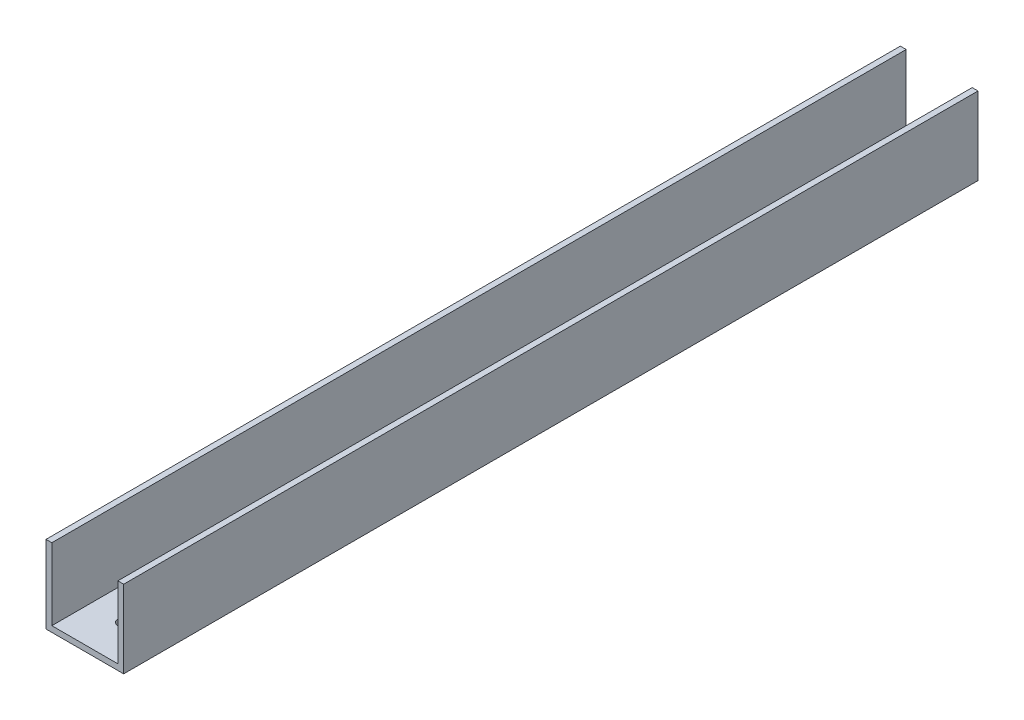
ISO-10303-21;
HEADER;
FILE_DESCRIPTION(('STEP AP214'),'2;1');
FILE_NAME('part.step','',(''),(''),'','','');
FILE_SCHEMA(('AUTOMOTIVE_DESIGN { 1 0 10303 214 1 1 1 1 }'));
ENDSEC;
DATA;
#1=APPLICATION_CONTEXT('core data for automotive mechanical design processes');
#2=APPLICATION_PROTOCOL_DEFINITION('international standard','automotive_design',2000,#1);
#3=PRODUCT_CONTEXT('',#1,'mechanical');
#4=PRODUCT('Part','Part','',(#3));
#5=PRODUCT_RELATED_PRODUCT_CATEGORY('part','',(#4));
#6=PRODUCT_DEFINITION_FORMATION('','',#4);
#7=PRODUCT_DEFINITION_CONTEXT('part definition',#1,'design');
#8=PRODUCT_DEFINITION('design','',#6,#7);
#9=PRODUCT_DEFINITION_SHAPE('','',#8);
#10=(LENGTH_UNIT() NAMED_UNIT(*) SI_UNIT(.MILLI.,.METRE.));
#11=(NAMED_UNIT(*) PLANE_ANGLE_UNIT() SI_UNIT($,.RADIAN.));
#12=(NAMED_UNIT(*) SI_UNIT($,.STERADIAN.) SOLID_ANGLE_UNIT());
#13=UNCERTAINTY_MEASURE_WITH_UNIT(LENGTH_MEASURE(1.E-05),#10,'distance_accuracy_value','');
#14=(GEOMETRIC_REPRESENTATION_CONTEXT(3) GLOBAL_UNCERTAINTY_ASSIGNED_CONTEXT((#13)) GLOBAL_UNIT_ASSIGNED_CONTEXT((#10,
#11,#12)) REPRESENTATION_CONTEXT('',''));
#15=CARTESIAN_POINT('',(0.,0.,0.));
#16=DIRECTION('',(0.,0.,1.));
#17=DIRECTION('',(1.,0.,0.));
#18=AXIS2_PLACEMENT_3D('',#15,#16,#17);
#19=CARTESIAN_POINT('',(-24.3452569943498,11.3571200850159,220.));
#20=DIRECTION('',(0.,-1.,0.));
#21=DIRECTION('',(1.,0.,0.));
#22=AXIS2_PLACEMENT_3D('',#19,#20,#21);
#23=PLANE('',#22);
#24=DIRECTION('',(-1.,0.,0.));
#25=VECTOR('',#24,1.);
#26=CARTESIAN_POINT('',(-24.3452569943498,11.3571200850159,0.));
#27=LINE('',#26,#25);
#28=CARTESIAN_POINT('',(-24.3452569943498,11.3571200850159,0.));
#29=VERTEX_POINT('',#28);
#30=CARTESIAN_POINT('',(-25.8452569943498,11.357120085016,0.));
#31=VERTEX_POINT('',#30);
#32=EDGE_CURVE('E128',#29,#31,#27,.T.);
#33=ORIENTED_EDGE('',*,*,#32,.T.);
#34=DIRECTION('',(0.,0.,-1.));
#35=VECTOR('',#34,1.);
#36=CARTESIAN_POINT('',(-25.8452569943498,11.357120085016,220.));
#37=LINE('',#36,#35);
#38=CARTESIAN_POINT('',(-25.8452569943498,11.357120085016,220.));
#39=VERTEX_POINT('',#38);
#40=EDGE_CURVE('E11',#39,#31,#37,.T.);
#41=ORIENTED_EDGE('',*,*,#40,.F.);
#42=DIRECTION('',(-1.,0.,0.));
#43=VECTOR('',#42,1.);
#44=CARTESIAN_POINT('',(-24.3452569943498,11.3571200850159,220.));
#45=LINE('',#44,#43);
#46=CARTESIAN_POINT('',(-24.3452569943498,11.3571200850159,220.));
#47=VERTEX_POINT('',#46);
#48=EDGE_CURVE('E143',#47,#39,#45,.T.);
#49=ORIENTED_EDGE('',*,*,#48,.F.);
#50=DIRECTION('',(0.,0.,-1.));
#51=VECTOR('',#50,1.);
#52=CARTESIAN_POINT('',(-24.3452569943498,11.3571200850159,220.));
#53=LINE('',#52,#51);
#54=EDGE_CURVE('E124',#47,#29,#53,.T.);
#55=ORIENTED_EDGE('',*,*,#54,.T.);
#56=EDGE_LOOP('',(#33,#41,#49,#55));
#57=FACE_BOUND('',#56,.T.);
#58=ADVANCED_FACE('F30',(#57),#23,.F.);
#59=CARTESIAN_POINT('',(-25.8452569943498,11.357120085016,220.));
#60=DIRECTION('',(1.,0.,0.));
#61=DIRECTION('',(0.,1.,0.));
#62=AXIS2_PLACEMENT_3D('',#59,#60,#61);
#63=PLANE('',#62);
#64=DIRECTION('',(0.,-1.,0.));
#65=VECTOR('',#64,1.);
#66=CARTESIAN_POINT('',(-25.8452569943498,11.357120085016,0.));
#67=LINE('',#66,#65);
#68=CARTESIAN_POINT('',(-25.8452569943498,-8.64287991498405,0.));
#69=VERTEX_POINT('',#68);
#70=EDGE_CURVE('E131',#31,#69,#67,.T.);
#71=ORIENTED_EDGE('',*,*,#70,.T.);
#72=DIRECTION('',(0.,0.,-1.));
#73=VECTOR('',#72,1.);
#74=CARTESIAN_POINT('',(-25.8452569943498,-8.64287991498405,220.));
#75=LINE('',#74,#73);
#76=CARTESIAN_POINT('',(-25.8452569943498,-8.64287991498405,220.));
#77=VERTEX_POINT('',#76);
#78=EDGE_CURVE('E39',#77,#69,#75,.T.);
#79=ORIENTED_EDGE('',*,*,#78,.F.);
#80=DIRECTION('',(0.,-1.,0.));
#81=VECTOR('',#80,1.);
#82=CARTESIAN_POINT('',(-25.8452569943498,11.357120085016,220.));
#83=LINE('',#82,#81);
#84=EDGE_CURVE('E91',#39,#77,#83,.T.);
#85=ORIENTED_EDGE('',*,*,#84,.F.);
#86=ORIENTED_EDGE('',*,*,#40,.T.);
#87=EDGE_LOOP('',(#71,#79,#85,#86));
#88=FACE_BOUND('',#87,.T.);
#89=ADVANCED_FACE('F218',(#88),#63,.F.);
#90=CARTESIAN_POINT('',(-25.8452569943498,-8.64287991498405,220.));
#91=DIRECTION('',(0.,1.,0.));
#92=DIRECTION('',(0.,0.,1.));
#93=AXIS2_PLACEMENT_3D('',#90,#91,#92);
#94=PLANE('',#93);
#95=CARTESIAN_POINT('',(-15.8452569943498,-8.64287991498405,60.));
#96=DIRECTION('',(0.,-1.,0.));
#97=DIRECTION('',(0.,0.,-1.));
#98=AXIS2_PLACEMENT_3D('',#95,#96,#97);
#99=CIRCLE('',#98,1.5);
#100=CARTESIAN_POINT('',(-15.8452569943498,-8.64287991498405,58.5));
#101=VERTEX_POINT('',#100);
#102=EDGE_CURVE('E177',#101,#101,#99,.T.);
#103=ORIENTED_EDGE('',*,*,#102,.F.);
#104=EDGE_LOOP('',(#103));
#105=FACE_BOUND('',#104,.T.);
#106=CARTESIAN_POINT('',(-15.8452569943498,-8.64287991498405,110.));
#107=DIRECTION('',(0.,-1.,0.));
#108=DIRECTION('',(0.,0.,-1.));
#109=AXIS2_PLACEMENT_3D('',#106,#107,#108);
#110=CIRCLE('',#109,1.5);
#111=CARTESIAN_POINT('',(-15.8452569943498,-8.64287991498405,108.5));
#112=VERTEX_POINT('',#111);
#113=EDGE_CURVE('E167',#112,#112,#110,.T.);
#114=ORIENTED_EDGE('',*,*,#113,.F.);
#115=EDGE_LOOP('',(#114));
#116=FACE_BOUND('',#115,.T.);
#117=CARTESIAN_POINT('',(-15.8452569943498,-8.64287991498405,160.));
#118=DIRECTION('',(0.,-1.,0.));
#119=DIRECTION('',(0.,0.,-1.));
#120=AXIS2_PLACEMENT_3D('',#117,#118,#119);
#121=CIRCLE('',#120,1.5);
#122=CARTESIAN_POINT('',(-15.8452569943498,-8.64287991498405,158.5));
#123=VERTEX_POINT('',#122);
#124=EDGE_CURVE('E164',#123,#123,#121,.T.);
#125=ORIENTED_EDGE('',*,*,#124,.F.);
#126=EDGE_LOOP('',(#125));
#127=FACE_BOUND('',#126,.T.);
#128=CARTESIAN_POINT('',(-15.8452569943497,-8.64287991498405,10.));
#129=DIRECTION('',(0.,-1.,0.));
#130=DIRECTION('',(0.,0.,-1.));
#131=AXIS2_PLACEMENT_3D('',#128,#129,#130);
#132=CIRCLE('',#131,1.5);
#133=CARTESIAN_POINT('',(-15.8452569943497,-8.64287991498405,8.5));
#134=VERTEX_POINT('',#133);
#135=EDGE_CURVE('E161',#134,#134,#132,.T.);
#136=ORIENTED_EDGE('',*,*,#135,.F.);
#137=EDGE_LOOP('',(#136));
#138=FACE_BOUND('',#137,.T.);
#139=CARTESIAN_POINT('',(-15.8452569943498,-8.64287991498405,210.));
#140=DIRECTION('',(0.,-1.,0.));
#141=DIRECTION('',(0.,0.,-1.));
#142=AXIS2_PLACEMENT_3D('',#139,#140,#141);
#143=CIRCLE('',#142,1.5);
#144=CARTESIAN_POINT('',(-15.8452569943498,-8.64287991498405,208.5));
#145=VERTEX_POINT('',#144);
#146=EDGE_CURVE('E157',#145,#145,#143,.T.);
#147=ORIENTED_EDGE('',*,*,#146,.F.);
#148=EDGE_LOOP('',(#147));
#149=FACE_BOUND('',#148,.T.);
#150=DIRECTION('',(1.,0.,0.));
#151=VECTOR('',#150,1.);
#152=CARTESIAN_POINT('',(-25.8452569943498,-8.64287991498405,0.));
#153=LINE('',#152,#151);
#154=CARTESIAN_POINT('',(-5.84525699434977,-8.64287991498405,0.));
#155=VERTEX_POINT('',#154);
#156=EDGE_CURVE('E134',#69,#155,#153,.T.);
#157=ORIENTED_EDGE('',*,*,#156,.T.);
#158=DIRECTION('',(0.,0.,-1.));
#159=VECTOR('',#158,1.);
#160=CARTESIAN_POINT('',(-5.84525699434977,-8.64287991498405,220.));
#161=LINE('',#160,#159);
#162=CARTESIAN_POINT('',(-5.84525699434977,-8.64287991498405,220.));
#163=VERTEX_POINT('',#162);
#164=EDGE_CURVE('E150',#163,#155,#161,.T.);
#165=ORIENTED_EDGE('',*,*,#164,.F.);
#166=DIRECTION('',(1.,0.,0.));
#167=VECTOR('',#166,1.);
#168=CARTESIAN_POINT('',(-25.8452569943498,-8.64287991498405,220.));
#169=LINE('',#168,#167);
#170=EDGE_CURVE('E186',#77,#163,#169,.T.);
#171=ORIENTED_EDGE('',*,*,#170,.F.);
#172=ORIENTED_EDGE('',*,*,#78,.T.);
#173=EDGE_LOOP('',(#157,#165,#171,#172));
#174=FACE_BOUND('',#173,.T.);
#175=ADVANCED_FACE('F222',(#105,#116,#127,#138,#149,#174),#94,.F.);
#176=CARTESIAN_POINT('',(-5.84525699434977,-8.64287991498405,220.));
#177=DIRECTION('',(-1.,0.,0.));
#178=DIRECTION('',(0.,0.,1.));
#179=AXIS2_PLACEMENT_3D('',#176,#177,#178);
#180=PLANE('',#179);
#181=DIRECTION('',(0.,1.,0.));
#182=VECTOR('',#181,1.);
#183=CARTESIAN_POINT('',(-5.84525699434977,-8.64287991498405,0.));
#184=LINE('',#183,#182);
#185=CARTESIAN_POINT('',(-5.84525699434977,11.357120085016,0.));
#186=VERTEX_POINT('',#185);
#187=EDGE_CURVE('E136',#155,#186,#184,.T.);
#188=ORIENTED_EDGE('',*,*,#187,.T.);
#189=DIRECTION('',(0.,0.,-1.));
#190=VECTOR('',#189,1.);
#191=CARTESIAN_POINT('',(-5.84525699434977,11.357120085016,220.));
#192=LINE('',#191,#190);
#193=CARTESIAN_POINT('',(-5.84525699434977,11.357120085016,220.));
#194=VERTEX_POINT('',#193);
#195=EDGE_CURVE('E147',#194,#186,#192,.T.);
#196=ORIENTED_EDGE('',*,*,#195,.F.);
#197=DIRECTION('',(0.,1.,0.));
#198=VECTOR('',#197,1.);
#199=CARTESIAN_POINT('',(-5.84525699434977,-8.64287991498405,220.));
#200=LINE('',#199,#198);
#201=EDGE_CURVE('E188',#163,#194,#200,.T.);
#202=ORIENTED_EDGE('',*,*,#201,.F.);
#203=ORIENTED_EDGE('',*,*,#164,.T.);
#204=EDGE_LOOP('',(#188,#196,#202,#203));
#205=FACE_BOUND('',#204,.T.);
#206=ADVANCED_FACE('F194',(#205),#180,.F.);
#207=CARTESIAN_POINT('',(-5.84525699434977,11.357120085016,220.));
#208=DIRECTION('',(0.,-1.,0.));
#209=DIRECTION('',(1.,0.,0.));
#210=AXIS2_PLACEMENT_3D('',#207,#208,#209);
#211=PLANE('',#210);
#212=DIRECTION('',(-1.,0.,0.));
#213=VECTOR('',#212,1.);
#214=CARTESIAN_POINT('',(-5.84525699434977,11.357120085016,0.));
#215=LINE('',#214,#213);
#216=CARTESIAN_POINT('',(-7.34525699434977,11.357120085016,0.));
#217=VERTEX_POINT('',#216);
#218=EDGE_CURVE('E138',#186,#217,#215,.T.);
#219=ORIENTED_EDGE('',*,*,#218,.T.);
#220=DIRECTION('',(0.,0.,-1.));
#221=VECTOR('',#220,1.);
#222=CARTESIAN_POINT('',(-7.34525699434977,11.357120085016,220.));
#223=LINE('',#222,#221);
#224=CARTESIAN_POINT('',(-7.34525699434977,11.357120085016,220.));
#225=VERTEX_POINT('',#224);
#226=EDGE_CURVE('E119',#225,#217,#223,.T.);
#227=ORIENTED_EDGE('',*,*,#226,.F.);
#228=DIRECTION('',(-1.,0.,0.));
#229=VECTOR('',#228,1.);
#230=CARTESIAN_POINT('',(-5.84525699434977,11.357120085016,220.));
#231=LINE('',#230,#229);
#232=EDGE_CURVE('E110',#194,#225,#231,.T.);
#233=ORIENTED_EDGE('',*,*,#232,.F.);
#234=ORIENTED_EDGE('',*,*,#195,.T.);
#235=EDGE_LOOP('',(#219,#227,#233,#234));
#236=FACE_BOUND('',#235,.T.);
#237=ADVANCED_FACE('F198',(#236),#211,.F.);
#238=CARTESIAN_POINT('',(-7.34525699434977,11.357120085016,220.));
#239=DIRECTION('',(1.,0.,0.));
#240=DIRECTION('',(0.,1.,0.));
#241=AXIS2_PLACEMENT_3D('',#238,#239,#240);
#242=PLANE('',#241);
#243=DIRECTION('',(0.,-1.,0.));
#244=VECTOR('',#243,1.);
#245=CARTESIAN_POINT('',(-7.34525699434977,11.357120085016,0.));
#246=LINE('',#245,#244);
#247=CARTESIAN_POINT('',(-7.34525699434977,-7.14287991498405,0.));
#248=VERTEX_POINT('',#247);
#249=EDGE_CURVE('E118',#217,#248,#246,.T.);
#250=ORIENTED_EDGE('',*,*,#249,.T.);
#251=DIRECTION('',(0.,0.,-1.));
#252=VECTOR('',#251,1.);
#253=CARTESIAN_POINT('',(-7.34525699434977,-7.14287991498405,220.));
#254=LINE('',#253,#252);
#255=CARTESIAN_POINT('',(-7.34525699434977,-7.14287991498405,220.));
#256=VERTEX_POINT('',#255);
#257=EDGE_CURVE('E115',#256,#248,#254,.T.);
#258=ORIENTED_EDGE('',*,*,#257,.F.);
#259=DIRECTION('',(0.,-1.,0.));
#260=VECTOR('',#259,1.);
#261=CARTESIAN_POINT('',(-7.34525699434977,11.357120085016,220.));
#262=LINE('',#261,#260);
#263=EDGE_CURVE('E104',#225,#256,#262,.T.);
#264=ORIENTED_EDGE('',*,*,#263,.F.);
#265=ORIENTED_EDGE('',*,*,#226,.T.);
#266=EDGE_LOOP('',(#250,#258,#264,#265));
#267=FACE_BOUND('',#266,.T.);
#268=ADVANCED_FACE('F116',(#267),#242,.F.);
#269=CARTESIAN_POINT('',(-7.34525699434977,-7.14287991498405,220.));
#270=DIRECTION('',(0.,-1.,0.));
#271=DIRECTION('',(1.,0.,0.));
#272=AXIS2_PLACEMENT_3D('',#269,#270,#271);
#273=PLANE('',#272);
#274=CARTESIAN_POINT('',(-15.8452569943498,-7.14287991498405,60.));
#275=DIRECTION('',(0.,-1.,0.));
#276=DIRECTION('',(1.,0.,0.));
#277=AXIS2_PLACEMENT_3D('',#274,#275,#276);
#278=CIRCLE('',#277,1.5);
#279=CARTESIAN_POINT('',(-14.3452569943498,-7.14287991498405,60.));
#280=VERTEX_POINT('',#279);
#281=EDGE_CURVE('E33',#280,#280,#278,.T.);
#282=ORIENTED_EDGE('',*,*,#281,.T.);
#283=EDGE_LOOP('',(#282));
#284=FACE_BOUND('',#283,.T.);
#285=CARTESIAN_POINT('',(-15.8452569943498,-7.14287991498405,110.));
#286=DIRECTION('',(0.,-1.,0.));
#287=DIRECTION('',(1.,0.,0.));
#288=AXIS2_PLACEMENT_3D('',#285,#286,#287);
#289=CIRCLE('',#288,1.5);
#290=CARTESIAN_POINT('',(-14.3452569943498,-7.14287991498405,110.));
#291=VERTEX_POINT('',#290);
#292=EDGE_CURVE('E165',#291,#291,#289,.T.);
#293=ORIENTED_EDGE('',*,*,#292,.T.);
#294=EDGE_LOOP('',(#293));
#295=FACE_BOUND('',#294,.T.);
#296=CARTESIAN_POINT('',(-15.8452569943498,-7.14287991498405,160.));
#297=DIRECTION('',(0.,-1.,0.));
#298=DIRECTION('',(1.,0.,0.));
#299=AXIS2_PLACEMENT_3D('',#296,#297,#298);
#300=CIRCLE('',#299,1.5);
#301=CARTESIAN_POINT('',(-14.3452569943498,-7.14287991498405,160.));
#302=VERTEX_POINT('',#301);
#303=EDGE_CURVE('E162',#302,#302,#300,.T.);
#304=ORIENTED_EDGE('',*,*,#303,.T.);
#305=EDGE_LOOP('',(#304));
#306=FACE_BOUND('',#305,.T.);
#307=CARTESIAN_POINT('',(-15.8452569943497,-7.14287991498405,10.));
#308=DIRECTION('',(0.,-1.,0.));
#309=DIRECTION('',(1.,0.,0.));
#310=AXIS2_PLACEMENT_3D('',#307,#308,#309);
#311=CIRCLE('',#310,1.5);
#312=CARTESIAN_POINT('',(-14.3452569943497,-7.14287991498405,10.));
#313=VERTEX_POINT('',#312);
#314=EDGE_CURVE('E158',#313,#313,#311,.T.);
#315=ORIENTED_EDGE('',*,*,#314,.T.);
#316=EDGE_LOOP('',(#315));
#317=FACE_BOUND('',#316,.T.);
#318=CARTESIAN_POINT('',(-15.8452569943498,-7.14287991498405,210.));
#319=DIRECTION('',(0.,-1.,0.));
#320=DIRECTION('',(1.,0.,0.));
#321=AXIS2_PLACEMENT_3D('',#318,#319,#320);
#322=CIRCLE('',#321,1.5);
#323=CARTESIAN_POINT('',(-14.3452569943498,-7.14287991498405,210.));
#324=VERTEX_POINT('',#323);
#325=EDGE_CURVE('E132',#324,#324,#322,.T.);
#326=ORIENTED_EDGE('',*,*,#325,.T.);
#327=EDGE_LOOP('',(#326));
#328=FACE_BOUND('',#327,.T.);
#329=DIRECTION('',(-1.,0.,0.));
#330=VECTOR('',#329,1.);
#331=CARTESIAN_POINT('',(-7.34525699434977,-7.14287991498405,0.));
#332=LINE('',#331,#330);
#333=CARTESIAN_POINT('',(-24.3452569943498,-7.14287991498406,0.));
#334=VERTEX_POINT('',#333);
#335=EDGE_CURVE('E77',#248,#334,#332,.T.);
#336=ORIENTED_EDGE('',*,*,#335,.T.);
#337=DIRECTION('',(0.,0.,-1.));
#338=VECTOR('',#337,1.);
#339=CARTESIAN_POINT('',(-24.3452569943498,-7.14287991498406,220.));
#340=LINE('',#339,#338);
#341=CARTESIAN_POINT('',(-24.3452569943498,-7.14287991498406,220.));
#342=VERTEX_POINT('',#341);
#343=EDGE_CURVE('E120',#342,#334,#340,.T.);
#344=ORIENTED_EDGE('',*,*,#343,.F.);
#345=DIRECTION('',(-1.,0.,0.));
#346=VECTOR('',#345,1.);
#347=CARTESIAN_POINT('',(-7.34525699434977,-7.14287991498405,220.));
#348=LINE('',#347,#346);
#349=EDGE_CURVE('E108',#256,#342,#348,.T.);
#350=ORIENTED_EDGE('',*,*,#349,.F.);
#351=ORIENTED_EDGE('',*,*,#257,.T.);
#352=EDGE_LOOP('',(#336,#344,#350,#351));
#353=FACE_BOUND('',#352,.T.);
#354=ADVANCED_FACE('F122',(#284,#295,#306,#317,#328,#353),#273,.F.);
#355=CARTESIAN_POINT('',(-24.3452569943498,-7.14287991498406,220.));
#356=DIRECTION('',(-1.,0.,0.));
#357=DIRECTION('',(0.,-1.,0.));
#358=AXIS2_PLACEMENT_3D('',#355,#356,#357);
#359=PLANE('',#358);
#360=DIRECTION('',(0.,1.,0.));
#361=VECTOR('',#360,1.);
#362=CARTESIAN_POINT('',(-24.3452569943498,-7.14287991498406,0.));
#363=LINE('',#362,#361);
#364=EDGE_CURVE('E83',#334,#29,#363,.T.);
#365=ORIENTED_EDGE('',*,*,#364,.T.);
#366=ORIENTED_EDGE('',*,*,#54,.F.);
#367=DIRECTION('',(0.,1.,0.));
#368=VECTOR('',#367,1.);
#369=CARTESIAN_POINT('',(-24.3452569943498,-7.14287991498406,220.));
#370=LINE('',#369,#368);
#371=EDGE_CURVE('E48',#342,#47,#370,.T.);
#372=ORIENTED_EDGE('',*,*,#371,.F.);
#373=ORIENTED_EDGE('',*,*,#343,.T.);
#374=EDGE_LOOP('',(#365,#366,#372,#373));
#375=FACE_BOUND('',#374,.T.);
#376=ADVANCED_FACE('F206',(#375),#359,.F.);
#377=CARTESIAN_POINT('',(-25.8452569943498,11.357120085016,220.));
#378=DIRECTION('',(0.,0.,1.));
#379=DIRECTION('',(1.,0.,0.));
#380=AXIS2_PLACEMENT_3D('',#377,#378,#379);
#381=PLANE('',#380);
#382=ORIENTED_EDGE('',*,*,#48,.T.);
#383=ORIENTED_EDGE('',*,*,#84,.T.);
#384=ORIENTED_EDGE('',*,*,#170,.T.);
#385=ORIENTED_EDGE('',*,*,#201,.T.);
#386=ORIENTED_EDGE('',*,*,#232,.T.);
#387=ORIENTED_EDGE('',*,*,#263,.T.);
#388=ORIENTED_EDGE('',*,*,#349,.T.);
#389=ORIENTED_EDGE('',*,*,#371,.T.);
#390=EDGE_LOOP('',(#382,#383,#384,#385,#386,#387,#388,#389));
#391=FACE_BOUND('',#390,.T.);
#392=ADVANCED_FACE('F106',(#391),#381,.T.);
#393=CARTESIAN_POINT('',(-25.8452569943498,11.357120085016,0.));
#394=DIRECTION('',(0.,0.,1.));
#395=DIRECTION('',(1.,0.,0.));
#396=AXIS2_PLACEMENT_3D('',#393,#394,#395);
#397=PLANE('',#396);
#398=ORIENTED_EDGE('',*,*,#32,.F.);
#399=ORIENTED_EDGE('',*,*,#364,.F.);
#400=ORIENTED_EDGE('',*,*,#335,.F.);
#401=ORIENTED_EDGE('',*,*,#249,.F.);
#402=ORIENTED_EDGE('',*,*,#218,.F.);
#403=ORIENTED_EDGE('',*,*,#187,.F.);
#404=ORIENTED_EDGE('',*,*,#156,.F.);
#405=ORIENTED_EDGE('',*,*,#70,.F.);
#406=EDGE_LOOP('',(#398,#399,#400,#401,#402,#403,#404,#405));
#407=FACE_BOUND('',#406,.T.);
#408=ADVANCED_FACE('F201',(#407),#397,.F.);
#409=CARTESIAN_POINT('',(-15.8452569943498,191.357120085016,210.));
#410=DIRECTION('',(0.,-1.,0.));
#411=DIRECTION('',(0.,0.,-1.));
#412=AXIS2_PLACEMENT_3D('',#409,#410,#411);
#413=CYLINDRICAL_SURFACE('',#412,1.5);
#414=ORIENTED_EDGE('',*,*,#146,.T.);
#415=EDGE_LOOP('',(#414));
#416=FACE_BOUND('',#415,.T.);
#417=ORIENTED_EDGE('',*,*,#325,.F.);
#418=EDGE_LOOP('',(#417));
#419=FACE_BOUND('',#418,.T.);
#420=ADVANCED_FACE('F252',(#416,#419),#413,.F.);
#421=CARTESIAN_POINT('',(-15.8452569943497,191.357120085016,10.));
#422=DIRECTION('',(0.,-1.,0.));
#423=DIRECTION('',(0.,0.,-1.));
#424=AXIS2_PLACEMENT_3D('',#421,#422,#423);
#425=CYLINDRICAL_SURFACE('',#424,1.5);
#426=ORIENTED_EDGE('',*,*,#135,.T.);
#427=EDGE_LOOP('',(#426));
#428=FACE_BOUND('',#427,.T.);
#429=ORIENTED_EDGE('',*,*,#314,.F.);
#430=EDGE_LOOP('',(#429));
#431=FACE_BOUND('',#430,.T.);
#432=ADVANCED_FACE('F257',(#428,#431),#425,.F.);
#433=CARTESIAN_POINT('',(-15.8452569943498,191.357120085016,160.));
#434=DIRECTION('',(0.,-1.,0.));
#435=DIRECTION('',(0.,0.,-1.));
#436=AXIS2_PLACEMENT_3D('',#433,#434,#435);
#437=CYLINDRICAL_SURFACE('',#436,1.5);
#438=ORIENTED_EDGE('',*,*,#124,.T.);
#439=EDGE_LOOP('',(#438));
#440=FACE_BOUND('',#439,.T.);
#441=ORIENTED_EDGE('',*,*,#303,.F.);
#442=EDGE_LOOP('',(#441));
#443=FACE_BOUND('',#442,.T.);
#444=ADVANCED_FACE('F269',(#440,#443),#437,.F.);
#445=CARTESIAN_POINT('',(-15.8452569943498,191.357120085016,110.));
#446=DIRECTION('',(0.,-1.,0.));
#447=DIRECTION('',(0.,0.,-1.));
#448=AXIS2_PLACEMENT_3D('',#445,#446,#447);
#449=CYLINDRICAL_SURFACE('',#448,1.5);
#450=ORIENTED_EDGE('',*,*,#113,.T.);
#451=EDGE_LOOP('',(#450));
#452=FACE_BOUND('',#451,.T.);
#453=ORIENTED_EDGE('',*,*,#292,.F.);
#454=EDGE_LOOP('',(#453));
#455=FACE_BOUND('',#454,.T.);
#456=ADVANCED_FACE('F279',(#452,#455),#449,.F.);
#457=CARTESIAN_POINT('',(-15.8452569943498,191.357120085016,60.));
#458=DIRECTION('',(0.,-1.,0.));
#459=DIRECTION('',(0.,0.,-1.));
#460=AXIS2_PLACEMENT_3D('',#457,#458,#459);
#461=CYLINDRICAL_SURFACE('',#460,1.5);
#462=ORIENTED_EDGE('',*,*,#102,.T.);
#463=EDGE_LOOP('',(#462));
#464=FACE_BOUND('',#463,.T.);
#465=ORIENTED_EDGE('',*,*,#281,.F.);
#466=EDGE_LOOP('',(#465));
#467=FACE_BOUND('',#466,.T.);
#468=ADVANCED_FACE('F289',(#464,#467),#461,.F.);
#469=CLOSED_SHELL('',(#58,#89,#175,#206,#237,#268,#354,#376,#392,#408,#420,#432,#444,#456,#468));
#470=MANIFOLD_SOLID_BREP('B2',#469);
#471=ADVANCED_BREP_SHAPE_REPRESENTATION('',(#18,#470),#14);
#472=SHAPE_DEFINITION_REPRESENTATION(#9,#471);
ENDSEC;
END-ISO-10303-21;
